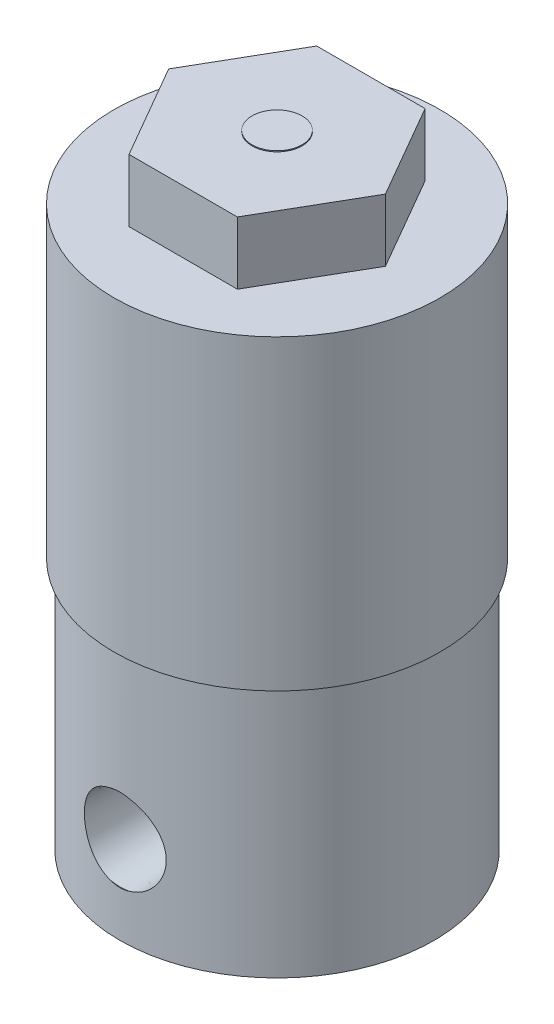
ISO-10303-21;
HEADER;
FILE_DESCRIPTION(('STEP AP214'),'2;1');
FILE_NAME('part.step','',(''),(''),'','','');
FILE_SCHEMA(('AUTOMOTIVE_DESIGN { 1 0 10303 214 1 1 1 1 }'));
ENDSEC;
DATA;
#1=APPLICATION_CONTEXT('core data for automotive mechanical design processes');
#2=APPLICATION_PROTOCOL_DEFINITION('international standard','automotive_design',2000,#1);
#3=PRODUCT_CONTEXT('',#1,'mechanical');
#4=PRODUCT('Part','Part','',(#3));
#5=PRODUCT_RELATED_PRODUCT_CATEGORY('part','',(#4));
#6=PRODUCT_DEFINITION_FORMATION('','',#4);
#7=PRODUCT_DEFINITION_CONTEXT('part definition',#1,'design');
#8=PRODUCT_DEFINITION('design','',#6,#7);
#9=PRODUCT_DEFINITION_SHAPE('','',#8);
#10=(LENGTH_UNIT() NAMED_UNIT(*) SI_UNIT(.MILLI.,.METRE.));
#11=(NAMED_UNIT(*) PLANE_ANGLE_UNIT() SI_UNIT($,.RADIAN.));
#12=(NAMED_UNIT(*) SI_UNIT($,.STERADIAN.) SOLID_ANGLE_UNIT());
#13=UNCERTAINTY_MEASURE_WITH_UNIT(LENGTH_MEASURE(1.E-05),#10,'distance_accuracy_value','');
#14=(GEOMETRIC_REPRESENTATION_CONTEXT(3) GLOBAL_UNCERTAINTY_ASSIGNED_CONTEXT((#13)) GLOBAL_UNIT_ASSIGNED_CONTEXT((#10,
#11,#12)) REPRESENTATION_CONTEXT('',''));
#15=CARTESIAN_POINT('',(0.,0.,0.));
#16=DIRECTION('',(0.,0.,1.));
#17=DIRECTION('',(1.,0.,0.));
#18=AXIS2_PLACEMENT_3D('',#15,#16,#17);
#19=CARTESIAN_POINT('',(0.,44.7,0.));
#20=DIRECTION('',(0.,1.,0.));
#21=DIRECTION('',(0.,0.,1.));
#22=AXIS2_PLACEMENT_3D('',#19,#20,#21);
#23=PLANE('',#22);
#24=CARTESIAN_POINT('',(0.,44.7,0.));
#25=DIRECTION('',(0.,1.,0.));
#26=DIRECTION('',(0.,0.,1.));
#27=AXIS2_PLACEMENT_3D('',#24,#25,#26);
#28=CIRCLE('',#27,13.03);
#29=CARTESIAN_POINT('',(0.,44.7,13.03));
#30=VERTEX_POINT('',#29);
#31=EDGE_CURVE('E221',#30,#30,#28,.T.);
#32=ORIENTED_EDGE('',*,*,#31,.T.);
#33=EDGE_LOOP('',(#32));
#34=FACE_BOUND('',#33,.T.);
#35=DIRECTION('',(-0.5,0.,-0.866025403784439));
#36=VECTOR('',#35,1.);
#37=CARTESIAN_POINT('',(8.66025403784438,44.7,0.));
#38=LINE('',#37,#36);
#39=CARTESIAN_POINT('',(8.66025403784438,44.7,0.));
#40=VERTEX_POINT('',#39);
#41=CARTESIAN_POINT('',(4.33012701892219,44.7,-7.5));
#42=VERTEX_POINT('',#41);
#43=EDGE_CURVE('E187',#40,#42,#38,.T.);
#44=ORIENTED_EDGE('',*,*,#43,.F.);
#45=DIRECTION('',(0.5,0.,-0.866025403784439));
#46=VECTOR('',#45,1.);
#47=CARTESIAN_POINT('',(4.33012701892219,44.7,7.5));
#48=LINE('',#47,#46);
#49=CARTESIAN_POINT('',(4.33012701892219,44.7,7.5));
#50=VERTEX_POINT('',#49);
#51=EDGE_CURVE('E162',#50,#40,#48,.T.);
#52=ORIENTED_EDGE('',*,*,#51,.F.);
#53=DIRECTION('',(1.,0.,0.));
#54=VECTOR('',#53,1.);
#55=CARTESIAN_POINT('',(-4.3301270189222,44.7,7.5));
#56=LINE('',#55,#54);
#57=CARTESIAN_POINT('',(-4.3301270189222,44.7,7.5));
#58=VERTEX_POINT('',#57);
#59=EDGE_CURVE('E168',#58,#50,#56,.T.);
#60=ORIENTED_EDGE('',*,*,#59,.F.);
#61=DIRECTION('',(0.5,0.,0.866025403784439));
#62=VECTOR('',#61,1.);
#63=CARTESIAN_POINT('',(-8.66025403784439,44.7,0.));
#64=LINE('',#63,#62);
#65=CARTESIAN_POINT('',(-8.66025403784439,44.7,0.));
#66=VERTEX_POINT('',#65);
#67=EDGE_CURVE('E196',#66,#58,#64,.T.);
#68=ORIENTED_EDGE('',*,*,#67,.F.);
#69=DIRECTION('',(-0.5,0.,0.866025403784439));
#70=VECTOR('',#69,1.);
#71=CARTESIAN_POINT('',(-4.3301270189222,44.7,-7.5));
#72=LINE('',#71,#70);
#73=CARTESIAN_POINT('',(-4.3301270189222,44.7,-7.5));
#74=VERTEX_POINT('',#73);
#75=EDGE_CURVE('E193',#74,#66,#72,.T.);
#76=ORIENTED_EDGE('',*,*,#75,.F.);
#77=DIRECTION('',(-1.,0.,0.));
#78=VECTOR('',#77,1.);
#79=CARTESIAN_POINT('',(4.33012701892219,44.7,-7.5));
#80=LINE('',#79,#78);
#81=EDGE_CURVE('E190',#42,#74,#80,.T.);
#82=ORIENTED_EDGE('',*,*,#81,.F.);
#83=EDGE_LOOP('',(#44,#52,#60,#68,#76,#82));
#84=FACE_BOUND('',#83,.T.);
#85=ADVANCED_FACE('F41',(#34,#84),#23,.T.);
#86=CARTESIAN_POINT('',(0.,20.19,0.));
#87=DIRECTION('',(0.,-1.,0.));
#88=DIRECTION('',(0.,0.,-1.));
#89=AXIS2_PLACEMENT_3D('',#86,#87,#88);
#90=CYLINDRICAL_SURFACE('',#89,12.56);
#91=CARTESIAN_POINT('',(0.788898573962425,3.76276021112784,-12.5352));
#92=CARTESIAN_POINT('',(0.877992046783151,3.78498595457341,-12.5296008390974));
#93=CARTESIAN_POINT('',(0.966077384943671,3.8109787394763,-12.5230958603472));
#94=CARTESIAN_POINT('',(1.13961109990667,3.87023240902184,-12.5084937022588));
#95=CARTESIAN_POINT('',(1.22506008108899,3.90349161350886,-12.5003968910304));
#96=CARTESIAN_POINT('',(1.39260427157268,3.97696220545809,-12.4828421567203));
#97=CARTESIAN_POINT('',(1.47470476337445,4.0171620739958,-12.4733864931202));
#98=CARTESIAN_POINT('',(1.63513200473562,4.1042165458238,-12.4533725275988));
#99=CARTESIAN_POINT('',(1.71345861244122,4.15107139900257,-12.4428141842769));
#100=CARTESIAN_POINT('',(1.94193866208237,4.30108963824454,-12.4099181050226));
#101=CARTESIAN_POINT('',(2.08580376350805,4.41379985096151,-12.3863360583298));
#102=CARTESIAN_POINT('',(2.35272921182999,4.66140672481568,-12.3384253170528));
#103=CARTESIAN_POINT('',(2.4757843498136,4.79630892417696,-12.3140964373251));
#104=CARTESIAN_POINT('',(2.70011309765983,5.08758685527581,-12.2668817928073));
#105=CARTESIAN_POINT('',(2.80093263275379,5.24431928583219,-12.2440318546701));
#106=CARTESIAN_POINT('',(2.97486996361045,5.57303338337697,-12.2029414624419));
#107=CARTESIAN_POINT('',(3.04798879807883,5.74501447828084,-12.184700835522));
#108=CARTESIAN_POINT('',(3.16368465755467,6.09775236998736,-12.1551741164053));
#109=CARTESIAN_POINT('',(3.2065413683194,6.27841186841878,-12.1438244778716));
#110=CARTESIAN_POINT('',(3.26134510157559,6.64465847523464,-12.1292232211872));
#111=CARTESIAN_POINT('',(3.27329977490954,6.83024435242987,-12.1259695986019));
#112=CARTESIAN_POINT('',(3.26599978076111,7.19557037188689,-12.127936523716));
#113=CARTESIAN_POINT('',(3.24760338180706,7.37532961380296,-12.1329240344468));
#114=CARTESIAN_POINT('',(3.18184035878198,7.72909360076873,-12.1503346674747));
#115=CARTESIAN_POINT('',(3.13447183564151,7.90309796780879,-12.1627582771932));
#116=CARTESIAN_POINT('',(3.01221767228601,8.24070982304539,-12.1936086121537));
#117=CARTESIAN_POINT('',(2.93731132732565,8.40430937937475,-12.2120398531426));
#118=CARTESIAN_POINT('',(2.76213964157896,8.71677696332193,-12.2528463849831));
#119=CARTESIAN_POINT('',(2.66187043273514,8.86564273908765,-12.2752222772706));
#120=CARTESIAN_POINT('',(2.43543081707597,9.14888464802036,-12.322174501744));
#121=CARTESIAN_POINT('',(2.30860961367872,9.28273365259162,-12.3467950977331));
#122=CARTESIAN_POINT('',(2.03425744986368,9.52735745722745,-12.3949490946325));
#123=CARTESIAN_POINT('',(1.88673087447343,9.63813713065744,-12.4184827243438));
#124=CARTESIAN_POINT('',(1.58596026109721,9.82649066148048,-12.4603225808739));
#125=CARTESIAN_POINT('',(1.43389528345359,9.9058827338659,-12.4788833610702));
#126=CARTESIAN_POINT('',(1.19760875195315,10.0064711699788,-12.5030254437535));
#127=CARTESIAN_POINT('',(1.11741366372719,10.0369344736574,-12.5104607952329));
#128=CARTESIAN_POINT('',(0.954748246454062,10.0914873284702,-12.523926455648));
#129=CARTESIAN_POINT('',(0.872277369583635,10.1155753299118,-12.529956422924));
#130=CARTESIAN_POINT('',(0.788898573962424,10.1363836809308,-12.5352));
#131=B_SPLINE_CURVE_WITH_KNOTS('',3,(#91,#92,#93,#94,#95,#96,#97,#98,#99,#100,#101,#102,#103,
#104,#105,#106,#107,#108,#109,#110,#111,#112,#113,#114,#115,#116,#117,#118,#119,#120,#121,#122,
#123,#124,#125,#126,#127,#128,#129,#130),.UNSPECIFIED.,.F.,.F.,(4,2,2,2,2,2,2,2,2,2,2,2,2,2,2,2,
2,2,2,4),(0.,0.275879747322894,0.551695772578802,0.827058370161299,1.10243131008807,
1.65248922542108,2.20268462183557,2.76324638468178,3.32378712580943,3.87907697197291,
4.43422932421709,4.97395047843362,5.51370701417062,6.05387020712794,6.59411582939499,
7.14959960399937,7.70496591409256,8.22029180163628,8.47837183534944,8.73651454502424),.UNSPECIFIED.);
#132=CARTESIAN_POINT('',(0.792070072657664,3.76355342756461,-12.535));
#133=VERTEX_POINT('',#132);
#134=CARTESIAN_POINT('',(0.79207007265764,10.135590464494,-12.535));
#135=VERTEX_POINT('',#134);
#136=EDGE_CURVE('E311',#133,#135,#131,.T.);
#137=ORIENTED_EDGE('',*,*,#136,.T.);
#138=CARTESIAN_POINT('',(0.83370061173436,10.1221594357594,-12.5322999999998));
#139=CARTESIAN_POINT('',(0.75486564278842,10.1483202494265,-12.5375535391951));
#140=CARTESIAN_POINT('',(0.674763011882068,10.1708365129458,-12.542126315415));
#141=CARTESIAN_POINT('',(0.512712357209269,10.208319226797,-12.5497907538505));
#142=CARTESIAN_POINT('',(0.430763677861175,10.2232829494152,-12.552881880926));
#143=CARTESIAN_POINT('',(0.268260713697007,10.2450468578194,-12.557390330899));
#144=CARTESIAN_POINT('',(0.187739079812136,10.2520799781308,-12.5588553923057));
#145=CARTESIAN_POINT('',(0.0264203248663634,10.2586834449056,-12.5602316878031));
#146=CARTESIAN_POINT('',(-0.0543766619753039,10.2582570178965,-12.5601435936903));
#147=CARTESIAN_POINT('',(-0.252425249853426,10.2480207968119,-12.5580085982188));
#148=CARTESIAN_POINT('',(-0.369470439382227,10.2340138359144,-12.5550853323868));
#149=CARTESIAN_POINT('',(-0.603200957254121,10.1901946543597,-12.5460766067035));
#150=CARTESIAN_POINT('',(-0.719817956967926,10.160031279743,-12.5399209528179));
#151=CARTESIAN_POINT('',(-0.833700611730567,10.1221594357607,-12.5323));
#152=B_SPLINE_CURVE_WITH_KNOTS('',3,(#138,#139,#140,#141,#142,#143,#144,#145,#146,#147,#148,
#149,#150,#151),.UNSPECIFIED.,.F.,.F.,(4,2,2,2,2,2,4),(0.,0.249612733617655,0.49931555423555,
0.741475862844617,0.983531430836682,1.3361532903437,1.69677018693214),.UNSPECIFIED.);
#153=CARTESIAN_POINT('',(-0.792070072657664,10.135590464494,-12.535));
#154=VERTEX_POINT('',#153);
#155=EDGE_CURVE('E11',#135,#154,#152,.T.);
#156=ORIENTED_EDGE('',*,*,#155,.T.);
#157=CARTESIAN_POINT('',(-0.78889857396244,10.1363836809308,-12.5352));
#158=CARTESIAN_POINT('',(-0.877992046783166,10.1141579374852,-12.5296008390974));
#159=CARTESIAN_POINT('',(-0.966077384943686,10.0881651525823,-12.5230958603472));
#160=CARTESIAN_POINT('',(-1.13961109990669,10.0289114830368,-12.5084937022588));
#161=CARTESIAN_POINT('',(-1.225060081089,9.99565227854978,-12.5003968910304));
#162=CARTESIAN_POINT('',(-1.39260427157269,9.92218168660055,-12.4828421567203));
#163=CARTESIAN_POINT('',(-1.47470476337446,9.88198181806284,-12.4733864931202));
#164=CARTESIAN_POINT('',(-1.63513200473563,9.79492734623484,-12.4533725275988));
#165=CARTESIAN_POINT('',(-1.71345861244123,9.74807249305606,-12.4428141842769));
#166=CARTESIAN_POINT('',(-1.94193866208238,9.59805425381409,-12.4099181050226));
#167=CARTESIAN_POINT('',(-2.08580376350806,9.48534404109713,-12.3863360583298));
#168=CARTESIAN_POINT('',(-2.35272921183,9.23773716724295,-12.3384253170528));
#169=CARTESIAN_POINT('',(-2.47578434981361,9.10283496788167,-12.3140964373251));
#170=CARTESIAN_POINT('',(-2.70011309765984,8.81155703678282,-12.2668817928073));
#171=CARTESIAN_POINT('',(-2.8009326327538,8.65482460622644,-12.2440318546701));
#172=CARTESIAN_POINT('',(-2.97486996361046,8.32611050868166,-12.2029414624419));
#173=CARTESIAN_POINT('',(-3.04798879807884,8.15412941377779,-12.184700835522));
#174=CARTESIAN_POINT('',(-3.16368465755467,7.80139152207126,-12.1551741164053));
#175=CARTESIAN_POINT('',(-3.2065413683194,7.62073202363984,-12.1438244778716));
#176=CARTESIAN_POINT('',(-3.26134510157559,7.25448541682398,-12.1292232211872));
#177=CARTESIAN_POINT('',(-3.27329977490954,7.06889953962876,-12.1259695986019));
#178=CARTESIAN_POINT('',(-3.26599978076111,6.70357352017174,-12.127936523716));
#179=CARTESIAN_POINT('',(-3.24760338180706,6.52381427825567,-12.1329240344468));
#180=CARTESIAN_POINT('',(-3.18184035878197,6.1700502912899,-12.1503346674747));
#181=CARTESIAN_POINT('',(-3.13447183564151,5.99604592424984,-12.1627582771932));
#182=CARTESIAN_POINT('',(-3.01221767228601,5.65843406901324,-12.1936086121537));
#183=CARTESIAN_POINT('',(-2.93731132732564,5.49483451268388,-12.2120398531426));
#184=CARTESIAN_POINT('',(-2.76213964157895,5.18236692873669,-12.2528463849831));
#185=CARTESIAN_POINT('',(-2.66187043273513,5.03350115297098,-12.2752222772706));
#186=CARTESIAN_POINT('',(-2.43543081707595,4.75025924403827,-12.322174501744));
#187=CARTESIAN_POINT('',(-2.30860961367871,4.61641023946701,-12.3467950977331));
#188=CARTESIAN_POINT('',(-2.03425744986367,4.37178643483119,-12.3949490946325));
#189=CARTESIAN_POINT('',(-1.88673087447342,4.2610067614012,-12.4184827243438));
#190=CARTESIAN_POINT('',(-1.5859602610972,4.07265323057816,-12.4603225808739));
#191=CARTESIAN_POINT('',(-1.43389528345359,3.99326115819274,-12.4788833610702));
#192=CARTESIAN_POINT('',(-1.19760875195315,3.89267272207982,-12.5030254437535));
#193=CARTESIAN_POINT('',(-1.1174136637272,3.86220941840128,-12.5104607952329));
#194=CARTESIAN_POINT('',(-0.954748246454074,3.8076565635884,-12.523926455648));
#195=CARTESIAN_POINT('',(-0.872277369583649,3.78356856214681,-12.529956422924));
#196=CARTESIAN_POINT('',(-0.78889857396244,3.76276021112784,-12.5352));
#197=B_SPLINE_CURVE_WITH_KNOTS('',3,(#157,#158,#159,#160,#161,#162,#163,#164,#165,#166,#167,
#168,#169,#170,#171,#172,#173,#174,#175,#176,#177,#178,#179,#180,#181,#182,#183,#184,#185,#186,
#187,#188,#189,#190,#191,#192,#193,#194,#195,#196),.UNSPECIFIED.,.F.,.F.,(4,2,2,2,2,2,2,2,2,2,2,
2,2,2,2,2,2,2,2,4),(0.,0.275879747322895,0.551695772578802,0.827058370161299,1.10243131008807,
1.65248922542108,2.20268462183557,2.76324638468179,3.32378712580943,3.87907697197291,
4.43422932421709,4.97395047843362,5.51370701417062,6.05387020712794,6.59411582939499,
7.14959960399937,7.70496591409256,8.22029180163626,8.47837183534942,8.73651454502421),.UNSPECIFIED.);
#198=CARTESIAN_POINT('',(-0.792070072657664,3.76355342756461,-12.535));
#199=VERTEX_POINT('',#198);
#200=EDGE_CURVE('E52',#154,#199,#197,.T.);
#201=ORIENTED_EDGE('',*,*,#200,.T.);
#202=CARTESIAN_POINT('',(-0.833700611730567,3.77698445629794,-12.5323));
#203=CARTESIAN_POINT('',(-0.754865642784579,3.75082364263098,-12.5375535391953));
#204=CARTESIAN_POINT('',(-0.674763011878184,3.72830737911185,-12.5421263154152));
#205=CARTESIAN_POINT('',(-0.512712357205311,3.69082466526084,-12.5497907538507));
#206=CARTESIAN_POINT('',(-0.430763677857186,3.67586094264275,-12.5528818809261));
#207=CARTESIAN_POINT('',(-0.268260713692968,3.6540970342388,-12.557390330899));
#208=CARTESIAN_POINT('',(-0.187739079808078,3.64706391392752,-12.5588553923058));
#209=CARTESIAN_POINT('',(-0.0264203248622799,3.64046044715303,-12.5602316878031));
#210=CARTESIAN_POINT('',(0.0543766619793943,3.64088687416224,-12.5601435936902));
#211=CARTESIAN_POINT('',(0.252425249857493,3.65112309524717,-12.5580085982188));
#212=CARTESIAN_POINT('',(0.369470439386257,3.66513005614486,-12.5550853323866));
#213=CARTESIAN_POINT('',(0.603200957258053,3.70894923769991,-12.5460766067034));
#214=CARTESIAN_POINT('',(0.719817956971795,3.73911261231672,-12.5399209528177));
#215=CARTESIAN_POINT('',(0.833700611734362,3.77698445629919,-12.5322999999998));
#216=B_SPLINE_CURVE_WITH_KNOTS('',3,(#202,#203,#204,#205,#206,#207,#208,#209,#210,#211,#212,
#213,#214,#215),.UNSPECIFIED.,.F.,.F.,(4,2,2,2,2,2,4),(0.,0.249612733617679,0.499315554235597,
0.741475862844686,0.983531430836774,1.33615329034375,1.69677018693215),.UNSPECIFIED.);
#217=EDGE_CURVE('E325',#199,#133,#216,.T.);
#218=ORIENTED_EDGE('',*,*,#217,.T.);
#219=EDGE_LOOP('',(#137,#156,#201,#218));
#220=FACE_BOUND('',#219,.T.);
#221=CARTESIAN_POINT('',(-0.788898573962439,3.77318826509852,12.5352));
#222=CARTESIAN_POINT('',(-0.877992046783166,3.7954140085441,12.5296008390974));
#223=CARTESIAN_POINT('',(-0.966077384943686,3.82140679344699,12.5230958603472));
#224=CARTESIAN_POINT('',(-1.13961109990669,3.88066046299252,12.5084937022588));
#225=CARTESIAN_POINT('',(-1.225060081089,3.91391966747954,12.5003968910304));
#226=CARTESIAN_POINT('',(-1.39260427157269,3.98739025942877,12.4828421567203));
#227=CARTESIAN_POINT('',(-1.47470476337446,4.02759012796648,12.4733864931202));
#228=CARTESIAN_POINT('',(-1.63513200473563,4.11464459979448,12.4533725275988));
#229=CARTESIAN_POINT('',(-1.71345861244123,4.16149945297326,12.4428141842769));
#230=CARTESIAN_POINT('',(-1.94193866208238,4.31151769221523,12.4099181050226));
#231=CARTESIAN_POINT('',(-2.08580376350806,4.4242279049322,12.3863360583298));
#232=CARTESIAN_POINT('',(-2.35272921183,4.67183477878637,12.3384253170528));
#233=CARTESIAN_POINT('',(-2.47578434981361,4.80673697814765,12.3140964373251));
#234=CARTESIAN_POINT('',(-2.70011309765984,5.0980149092465,12.2668817928073));
#235=CARTESIAN_POINT('',(-2.8009326327538,5.25474733980288,12.2440318546701));
#236=CARTESIAN_POINT('',(-2.97486996361045,5.58346143734766,12.2029414624419));
#237=CARTESIAN_POINT('',(-3.04798879807883,5.75544253225153,12.184700835522));
#238=CARTESIAN_POINT('',(-3.16368465755467,6.10818042395806,12.1551741164053));
#239=CARTESIAN_POINT('',(-3.2065413683194,6.28883992238948,12.1438244778716));
#240=CARTESIAN_POINT('',(-3.26134510157559,6.65508652920534,12.1292232211872));
#241=CARTESIAN_POINT('',(-3.27329977490954,6.84067240640057,12.1259695986019));
#242=CARTESIAN_POINT('',(-3.26599978076111,7.20599842585758,12.127936523716));
#243=CARTESIAN_POINT('',(-3.24760338180706,7.38575766777366,12.1329240344468));
#244=CARTESIAN_POINT('',(-3.18184035878197,7.73952165473942,12.1503346674747));
#245=CARTESIAN_POINT('',(-3.13447183564151,7.91352602177949,12.1627582771932));
#246=CARTESIAN_POINT('',(-3.01221767228601,8.25113787701608,12.1936086121537));
#247=CARTESIAN_POINT('',(-2.93731132732564,8.41473743334544,12.2120398531426));
#248=CARTESIAN_POINT('',(-2.76213964157895,8.72720501729263,12.2528463849831));
#249=CARTESIAN_POINT('',(-2.66187043273513,8.87607079305835,12.2752222772706));
#250=CARTESIAN_POINT('',(-2.43543081707595,9.15931270199105,12.322174501744));
#251=CARTESIAN_POINT('',(-2.30860961367871,9.29316170656231,12.3467950977331));
#252=CARTESIAN_POINT('',(-2.03425744986366,9.53778551119813,12.3949490946325));
#253=CARTESIAN_POINT('',(-1.88673087447342,9.64856518462813,12.4184827243438));
#254=CARTESIAN_POINT('',(-1.5859602610972,9.83691871545116,12.4603225808739));
#255=CARTESIAN_POINT('',(-1.43389528345359,9.91631078783658,12.4788833610702));
#256=CARTESIAN_POINT('',(-1.19760875195315,10.0168992239495,12.5030254437535));
#257=CARTESIAN_POINT('',(-1.11741366372719,10.047362527628,12.5104607952329));
#258=CARTESIAN_POINT('',(-0.954748246454072,10.1019153824409,12.523926455648));
#259=CARTESIAN_POINT('',(-0.872277369583648,10.1260033838825,12.529956422924));
#260=CARTESIAN_POINT('',(-0.788898573962439,10.1468117349015,12.5352));
#261=B_SPLINE_CURVE_WITH_KNOTS('',3,(#221,#222,#223,#224,#225,#226,#227,#228,#229,#230,#231,
#232,#233,#234,#235,#236,#237,#238,#239,#240,#241,#242,#243,#244,#245,#246,#247,#248,#249,#250,
#251,#252,#253,#254,#255,#256,#257,#258,#259,#260),.UNSPECIFIED.,.F.,.F.,(4,2,2,2,2,2,2,2,2,2,2,
2,2,2,2,2,2,2,2,4),(0.,0.275879747322894,0.551695772578802,0.8270583701613,1.10243131008807,
1.65248922542108,2.20268462183557,2.76324638468179,3.32378712580943,3.87907697197291,
4.43422932421709,4.97395047843362,5.51370701417062,6.05387020712794,6.59411582939499,
7.14959960399937,7.70496591409256,8.22029180163626,8.47837183534942,8.7365145450242),.UNSPECIFIED.);
#262=CARTESIAN_POINT('',(-0.792070072657664,3.77398148153529,12.535));
#263=VERTEX_POINT('',#262);
#264=CARTESIAN_POINT('',(-0.792070072657664,10.1460185184647,12.535));
#265=VERTEX_POINT('',#264);
#266=EDGE_CURVE('E283',#263,#265,#261,.T.);
#267=ORIENTED_EDGE('',*,*,#266,.T.);
#268=CARTESIAN_POINT('',(-0.833700611730567,10.1325874897314,12.5323));
#269=CARTESIAN_POINT('',(-0.75486564278458,10.1587483033983,12.5375535391953));
#270=CARTESIAN_POINT('',(-0.674763011878186,10.1812645669175,12.5421263154152));
#271=CARTESIAN_POINT('',(-0.512712357205314,10.2187472807685,12.5497907538507));
#272=CARTESIAN_POINT('',(-0.430763677857189,10.2337110033866,12.5528818809261));
#273=CARTESIAN_POINT('',(-0.268260713692973,10.2554749117905,12.557390330899));
#274=CARTESIAN_POINT('',(-0.187739079808084,10.2625080321018,12.5588553923058));
#275=CARTESIAN_POINT('',(-0.0264203248622866,10.2691114988763,12.5602316878031));
#276=CARTESIAN_POINT('',(0.054376661979387,10.2686850718671,12.5601435936902));
#277=CARTESIAN_POINT('',(0.252425249857486,10.2584488507822,12.5580085982188));
#278=CARTESIAN_POINT('',(0.369470439386251,10.2444418898845,12.5550853323866));
#279=CARTESIAN_POINT('',(0.603200957258049,10.2006227083294,12.5460766067034));
#280=CARTESIAN_POINT('',(0.719817956971792,10.1704593337126,12.5399209528177));
#281=CARTESIAN_POINT('',(0.83370061173436,10.1325874897301,12.5322999999998));
#282=B_SPLINE_CURVE_WITH_KNOTS('',3,(#268,#269,#270,#271,#272,#273,#274,#275,#276,#277,#278,
#279,#280,#281),.UNSPECIFIED.,.F.,.F.,(4,2,2,2,2,2,4),(0.,0.249612733617677,0.499315554235593,
0.74147586284468,0.983531430836766,1.33615329034374,1.69677018693214),.UNSPECIFIED.);
#283=CARTESIAN_POINT('',(0.792070072657664,10.1460185184647,12.535));
#284=VERTEX_POINT('',#283);
#285=EDGE_CURVE('E303',#265,#284,#282,.T.);
#286=ORIENTED_EDGE('',*,*,#285,.T.);
#287=CARTESIAN_POINT('',(0.788898573962424,10.1468117349015,12.5352));
#288=CARTESIAN_POINT('',(0.877992046783151,10.1245859914559,12.5296008390974));
#289=CARTESIAN_POINT('',(0.96607738494367,10.098593206553,12.5230958603472));
#290=CARTESIAN_POINT('',(1.13961109990667,10.0393395370075,12.5084937022588));
#291=CARTESIAN_POINT('',(1.22506008108899,10.0060803325205,12.5003968910304));
#292=CARTESIAN_POINT('',(1.39260427157268,9.93260974057123,12.4828421567203));
#293=CARTESIAN_POINT('',(1.47470476337444,9.89240987203353,12.4733864931202));
#294=CARTESIAN_POINT('',(1.63513200473562,9.80535540020552,12.4533725275988));
#295=CARTESIAN_POINT('',(1.71345861244122,9.75850054702675,12.4428141842769));
#296=CARTESIAN_POINT('',(1.94193866208237,9.60848230778478,12.4099181050226));
#297=CARTESIAN_POINT('',(2.08580376350804,9.49577209506782,12.3863360583298));
#298=CARTESIAN_POINT('',(2.35272921182999,9.24816522121364,12.3384253170528));
#299=CARTESIAN_POINT('',(2.4757843498136,9.11326302185236,12.3140964373251));
#300=CARTESIAN_POINT('',(2.70011309765983,8.82198509075351,12.2668817928073));
#301=CARTESIAN_POINT('',(2.80093263275379,8.66525266019713,12.2440318546701));
#302=CARTESIAN_POINT('',(2.97486996361045,8.33653856265235,12.2029414624419));
#303=CARTESIAN_POINT('',(3.04798879807883,8.16455746774849,12.184700835522));
#304=CARTESIAN_POINT('',(3.16368465755467,7.81181957604196,12.1551741164053));
#305=CARTESIAN_POINT('',(3.2065413683194,7.63116007761054,12.1438244778716));
#306=CARTESIAN_POINT('',(3.26134510157559,7.26491347079468,12.1292232211872));
#307=CARTESIAN_POINT('',(3.27329977490954,7.07932759359945,12.1259695986019));
#308=CARTESIAN_POINT('',(3.26599978076111,6.71400157414244,12.127936523716));
#309=CARTESIAN_POINT('',(3.24760338180706,6.53424233222636,12.1329240344468));
#310=CARTESIAN_POINT('',(3.18184035878198,6.1804783452606,12.1503346674747));
#311=CARTESIAN_POINT('',(3.13447183564151,6.00647397822053,12.1627582771932));
#312=CARTESIAN_POINT('',(3.01221767228601,5.66886212298394,12.1936086121537));
#313=CARTESIAN_POINT('',(2.93731132732565,5.50526256665458,12.2120398531426));
#314=CARTESIAN_POINT('',(2.76213964157896,5.19279498270739,12.2528463849831));
#315=CARTESIAN_POINT('',(2.66187043273514,5.04392920694167,12.2752222772706));
#316=CARTESIAN_POINT('',(2.43543081707597,4.76068729800896,12.322174501744));
#317=CARTESIAN_POINT('',(2.30860961367872,4.6268382934377,12.3467950977331));
#318=CARTESIAN_POINT('',(2.03425744986368,4.38221448880188,12.3949490946325));
#319=CARTESIAN_POINT('',(1.88673087447343,4.27143481537189,12.4184827243438));
#320=CARTESIAN_POINT('',(1.58596026109721,4.08308128454884,12.4603225808739));
#321=CARTESIAN_POINT('',(1.43389528345359,4.00368921216342,12.4788833610702));
#322=CARTESIAN_POINT('',(1.19760875195315,3.9031007760505,12.5030254437535));
#323=CARTESIAN_POINT('',(1.11741366372719,3.87263747237196,12.5104607952329));
#324=CARTESIAN_POINT('',(0.954748246454063,3.81808461755908,12.523926455648));
#325=CARTESIAN_POINT('',(0.872277369583636,3.79399661611748,12.529956422924));
#326=CARTESIAN_POINT('',(0.788898573962424,3.77318826509851,12.5352));
#327=B_SPLINE_CURVE_WITH_KNOTS('',3,(#287,#288,#289,#290,#291,#292,#293,#294,#295,#296,#297,
#298,#299,#300,#301,#302,#303,#304,#305,#306,#307,#308,#309,#310,#311,#312,#313,#314,#315,#316,
#317,#318,#319,#320,#321,#322,#323,#324,#325,#326),.UNSPECIFIED.,.F.,.F.,(4,2,2,2,2,2,2,2,2,2,2,
2,2,2,2,2,2,2,2,4),(0.,0.275879747322893,0.5516957725788,0.827058370161298,1.10243131008807,
1.65248922542108,2.20268462183556,2.76324638468178,3.32378712580943,3.87907697197291,
4.43422932421709,4.97395047843362,5.51370701417062,6.05387020712794,6.59411582939498,
7.14959960399936,7.70496591409256,8.22029180163627,8.47837183534944,8.73651454502424),.UNSPECIFIED.);
#328=CARTESIAN_POINT('',(0.792070072657664,3.77398148153529,12.535));
#329=VERTEX_POINT('',#328);
#330=EDGE_CURVE('E312',#284,#329,#327,.T.);
#331=ORIENTED_EDGE('',*,*,#330,.T.);
#332=CARTESIAN_POINT('',(0.833700611734362,3.78741251026987,12.5322999999998));
#333=CARTESIAN_POINT('',(0.754865642788423,3.7612516966028,12.5375535391951));
#334=CARTESIAN_POINT('',(0.674763011882071,3.73873543308355,12.542126315415));
#335=CARTESIAN_POINT('',(0.512712357209274,3.70125271923231,12.5497907538505));
#336=CARTESIAN_POINT('',(0.43076367786118,3.68628899661409,12.552881880926));
#337=CARTESIAN_POINT('',(0.268260713697014,3.6645250882099,12.557390330899));
#338=CARTESIAN_POINT('',(0.187739079812143,3.65749196789849,12.5588553923057));
#339=CARTESIAN_POINT('',(0.0264203248663719,3.65088850112375,12.5602316878031));
#340=CARTESIAN_POINT('',(-0.0543766619752948,3.65131492813283,12.5601435936903));
#341=CARTESIAN_POINT('',(-0.252425249853418,3.66155114921746,12.5580085982188));
#342=CARTESIAN_POINT('',(-0.369470439382221,3.67555811011497,12.5550853323868));
#343=CARTESIAN_POINT('',(-0.603200957254119,3.71937729166966,12.5460766067035));
#344=CARTESIAN_POINT('',(-0.719817956967925,3.74954066628631,12.5399209528179));
#345=CARTESIAN_POINT('',(-0.833700611730567,3.78741251026862,12.5323));
#346=B_SPLINE_CURVE_WITH_KNOTS('',3,(#332,#333,#334,#335,#336,#337,#338,#339,#340,#341,#342,
#343,#344,#345),.UNSPECIFIED.,.F.,.F.,(4,2,2,2,2,2,4),(0.,0.249612733617653,0.499315554235546,
0.741475862844611,0.983531430836675,1.3361532903437,1.69677018693215),.UNSPECIFIED.);
#347=EDGE_CURVE('E271',#329,#263,#346,.T.);
#348=ORIENTED_EDGE('',*,*,#347,.T.);
#349=EDGE_LOOP('',(#267,#286,#331,#348));
#350=FACE_BOUND('',#349,.T.);
#351=CARTESIAN_POINT('',(0.,20.19,0.));
#352=DIRECTION('',(0.,1.,0.));
#353=DIRECTION('',(0.,0.,1.));
#354=AXIS2_PLACEMENT_3D('',#351,#352,#353);
#355=CIRCLE('',#354,12.56);
#356=CARTESIAN_POINT('',(0.,20.19,12.56));
#357=VERTEX_POINT('',#356);
#358=EDGE_CURVE('E267',#357,#357,#355,.T.);
#359=ORIENTED_EDGE('',*,*,#358,.F.);
#360=EDGE_LOOP('',(#359));
#361=FACE_BOUND('',#360,.T.);
#362=CARTESIAN_POINT('',(0.,0.,0.));
#363=DIRECTION('',(0.,1.,0.));
#364=DIRECTION('',(0.,0.,1.));
#365=AXIS2_PLACEMENT_3D('',#362,#363,#364);
#366=CIRCLE('',#365,12.56);
#367=CARTESIAN_POINT('',(0.,0.,12.56));
#368=VERTEX_POINT('',#367);
#369=EDGE_CURVE('E266',#368,#368,#366,.T.);
#370=ORIENTED_EDGE('',*,*,#369,.T.);
#371=EDGE_LOOP('',(#370));
#372=FACE_BOUND('',#371,.T.);
#373=ADVANCED_FACE('F43',(#220,#350,#361,#372),#90,.T.);
#374=CARTESIAN_POINT('',(0.,0.,0.));
#375=DIRECTION('',(0.,1.,0.));
#376=DIRECTION('',(0.,0.,1.));
#377=AXIS2_PLACEMENT_3D('',#374,#375,#376);
#378=PLANE('',#377);
#379=CARTESIAN_POINT('',(-9.33500000000009,0.,0.));
#380=DIRECTION('',(0.,-1.,0.));
#381=DIRECTION('',(0.,0.,-1.));
#382=AXIS2_PLACEMENT_3D('',#379,#380,#381);
#383=CIRCLE('',#382,2.8829);
#384=CARTESIAN_POINT('',(-9.33500000000009,0.,-2.8829));
#385=VERTEX_POINT('',#384);
#386=EDGE_CURVE('E151',#385,#385,#383,.T.);
#387=ORIENTED_EDGE('',*,*,#386,.F.);
#388=EDGE_LOOP('',(#387));
#389=FACE_BOUND('',#388,.T.);
#390=CARTESIAN_POINT('',(9.335,0.,0.));
#391=DIRECTION('',(0.,-1.,0.));
#392=DIRECTION('',(0.,0.,-1.));
#393=AXIS2_PLACEMENT_3D('',#390,#391,#392);
#394=CIRCLE('',#393,2.8829);
#395=CARTESIAN_POINT('',(9.335,0.,-2.8829));
#396=VERTEX_POINT('',#395);
#397=EDGE_CURVE('E142',#396,#396,#394,.T.);
#398=ORIENTED_EDGE('',*,*,#397,.F.);
#399=EDGE_LOOP('',(#398));
#400=FACE_BOUND('',#399,.T.);
#401=ORIENTED_EDGE('',*,*,#369,.F.);
#402=EDGE_LOOP('',(#401));
#403=FACE_BOUND('',#402,.T.);
#404=ADVANCED_FACE('F407',(#389,#400,#403),#378,.F.);
#405=CARTESIAN_POINT('',(0.,6.96,12.535));
#406=DIRECTION('',(0.,0.,1.));
#407=DIRECTION('',(1.,0.,0.));
#408=AXIS2_PLACEMENT_3D('',#405,#406,#407);
#409=CONICAL_SURFACE('',#408,3.283,0.0312064870256584);
#410=CARTESIAN_POINT('',(0.,6.96,5.16));
#411=DIRECTION('',(0.,0.,1.));
#412=DIRECTION('',(1.,0.,0.));
#413=AXIS2_PLACEMENT_3D('',#410,#411,#412);
#414=CIRCLE('',#413,3.05277741964332);
#415=CARTESIAN_POINT('',(3.05277741964332,6.96,5.16));
#416=VERTEX_POINT('',#415);
#417=EDGE_CURVE('E254',#416,#416,#414,.T.);
#418=ORIENTED_EDGE('',*,*,#417,.F.);
#419=EDGE_LOOP('',(#418));
#420=FACE_BOUND('',#419,.T.);
#421=CARTESIAN_POINT('',(0.,6.96,12.535));
#422=DIRECTION('',(0.,0.,1.));
#423=DIRECTION('',(1.,0.,0.));
#424=AXIS2_PLACEMENT_3D('',#421,#422,#423);
#425=CIRCLE('',#424,3.283);
#426=EDGE_CURVE('E250',#284,#265,#425,.T.);
#427=ORIENTED_EDGE('',*,*,#426,.T.);
#428=ORIENTED_EDGE('',*,*,#266,.F.);
#429=EDGE_CURVE('E249',#263,#329,#425,.T.);
#430=ORIENTED_EDGE('',*,*,#429,.T.);
#431=ORIENTED_EDGE('',*,*,#330,.F.);
#432=EDGE_LOOP('',(#427,#428,#430,#431));
#433=FACE_BOUND('',#432,.T.);
#434=ADVANCED_FACE('F295',(#420,#433),#409,.F.);
#435=CARTESIAN_POINT('',(0.,6.96,12.56));
#436=DIRECTION('',(0.,0.,1.));
#437=DIRECTION('',(1.,0.,0.));
#438=AXIS2_PLACEMENT_3D('',#435,#436,#437);
#439=CONICAL_SURFACE('',#438,3.308,0.785398163397431);
#440=ORIENTED_EDGE('',*,*,#426,.F.);
#441=ORIENTED_EDGE('',*,*,#285,.F.);
#442=EDGE_LOOP('',(#440,#441));
#443=FACE_BOUND('',#442,.T.);
#444=ADVANCED_FACE('F290',(#443),#439,.F.);
#445=ORIENTED_EDGE('',*,*,#429,.F.);
#446=ORIENTED_EDGE('',*,*,#347,.F.);
#447=EDGE_LOOP('',(#445,#446));
#448=FACE_BOUND('',#447,.T.);
#449=ADVANCED_FACE('F294',(#448),#439,.F.);
#450=CARTESIAN_POINT('',(0.,6.96,4.06));
#451=DIRECTION('',(0.,0.,1.));
#452=DIRECTION('',(1.,0.,0.));
#453=AXIS2_PLACEMENT_3D('',#450,#451,#452);
#454=CONICAL_SURFACE('',#453,3.95,1.02974425867665);
#455=CARTESIAN_POINT('',(0.,6.96,1.68660055484114));
#456=VERTEX_POINT('',#455);
#457=VERTEX_LOOP('',#456);
#458=FACE_BOUND('',#457,.T.);
#459=CARTESIAN_POINT('',(0.,6.96,4.06));
#460=DIRECTION('',(0.,0.,1.));
#461=DIRECTION('',(1.,0.,0.));
#462=AXIS2_PLACEMENT_3D('',#459,#460,#461);
#463=CIRCLE('',#462,3.95);
#464=CARTESIAN_POINT('',(3.95,6.96,4.06));
#465=VERTEX_POINT('',#464);
#466=EDGE_CURVE('E262',#465,#465,#463,.T.);
#467=ORIENTED_EDGE('',*,*,#466,.T.);
#468=EDGE_LOOP('',(#467));
#469=FACE_BOUND('',#468,.T.);
#470=ADVANCED_FACE('F507',(#458,#469),#454,.F.);
#471=CARTESIAN_POINT('',(0.,6.96,12.56));
#472=DIRECTION('',(0.,0.,1.));
#473=DIRECTION('',(1.,0.,0.));
#474=AXIS2_PLACEMENT_3D('',#471,#472,#473);
#475=CYLINDRICAL_SURFACE('',#474,3.95);
#476=ORIENTED_EDGE('',*,*,#466,.F.);
#477=EDGE_LOOP('',(#476));
#478=FACE_BOUND('',#477,.T.);
#479=CARTESIAN_POINT('',(0.,6.96,5.16));
#480=DIRECTION('',(0.,0.,1.));
#481=DIRECTION('',(1.,0.,0.));
#482=AXIS2_PLACEMENT_3D('',#479,#480,#481);
#483=CIRCLE('',#482,3.95);
#484=CARTESIAN_POINT('',(3.95,6.96,5.16));
#485=VERTEX_POINT('',#484);
#486=EDGE_CURVE('E258',#485,#485,#483,.T.);
#487=ORIENTED_EDGE('',*,*,#486,.T.);
#488=EDGE_LOOP('',(#487));
#489=FACE_BOUND('',#488,.T.);
#490=ADVANCED_FACE('F500',(#478,#489),#475,.F.);
#491=CARTESIAN_POINT('',(3.95,6.96,5.16));
#492=DIRECTION('',(0.,0.,1.));
#493=DIRECTION('',(1.,0.,0.));
#494=AXIS2_PLACEMENT_3D('',#491,#492,#493);
#495=PLANE('',#494);
#496=ORIENTED_EDGE('',*,*,#486,.F.);
#497=EDGE_LOOP('',(#496));
#498=FACE_BOUND('',#497,.T.);
#499=ORIENTED_EDGE('',*,*,#417,.T.);
#500=EDGE_LOOP('',(#499));
#501=FACE_BOUND('',#500,.T.);
#502=ADVANCED_FACE('F493',(#498,#501),#495,.F.);
#503=CARTESIAN_POINT('',(0.,6.94957194602932,-12.56));
#504=DIRECTION('',(0.,0.,-1.));
#505=DIRECTION('',(-1.,0.,0.));
#506=AXIS2_PLACEMENT_3D('',#503,#504,#505);
#507=CONICAL_SURFACE('',#506,3.308,0.785398163397414);
#508=CARTESIAN_POINT('',(0.,6.94957194602932,-12.535));
#509=DIRECTION('',(0.,0.,-1.));
#510=DIRECTION('',(-1.,0.,0.));
#511=AXIS2_PLACEMENT_3D('',#508,#509,#510);
#512=CIRCLE('',#511,3.283);
#513=EDGE_CURVE('E234',#154,#135,#512,.T.);
#514=ORIENTED_EDGE('',*,*,#513,.F.);
#515=ORIENTED_EDGE('',*,*,#155,.F.);
#516=EDGE_LOOP('',(#514,#515));
#517=FACE_BOUND('',#516,.T.);
#518=ADVANCED_FACE('F338',(#517),#507,.F.);
#519=EDGE_CURVE('E233',#133,#199,#512,.T.);
#520=ORIENTED_EDGE('',*,*,#519,.F.);
#521=ORIENTED_EDGE('',*,*,#217,.F.);
#522=EDGE_LOOP('',(#520,#521));
#523=FACE_BOUND('',#522,.T.);
#524=ADVANCED_FACE('F336',(#523),#507,.F.);
#525=CARTESIAN_POINT('',(0.,6.94957194602932,-12.535));
#526=DIRECTION('',(0.,0.,-1.));
#527=DIRECTION('',(-1.,0.,0.));
#528=AXIS2_PLACEMENT_3D('',#525,#526,#527);
#529=CONICAL_SURFACE('',#528,3.283,0.0312064870256583);
#530=CARTESIAN_POINT('',(0.,6.94957194602932,-5.16));
#531=DIRECTION('',(0.,0.,-1.));
#532=DIRECTION('',(-1.,0.,0.));
#533=AXIS2_PLACEMENT_3D('',#530,#531,#532);
#534=CIRCLE('',#533,3.05277741964332);
#535=CARTESIAN_POINT('',(-3.05277741964332,6.94957194602932,-5.16));
#536=VERTEX_POINT('',#535);
#537=EDGE_CURVE('E237',#536,#536,#534,.T.);
#538=ORIENTED_EDGE('',*,*,#537,.F.);
#539=EDGE_LOOP('',(#538));
#540=FACE_BOUND('',#539,.T.);
#541=ORIENTED_EDGE('',*,*,#513,.T.);
#542=ORIENTED_EDGE('',*,*,#136,.F.);
#543=ORIENTED_EDGE('',*,*,#519,.T.);
#544=ORIENTED_EDGE('',*,*,#200,.F.);
#545=EDGE_LOOP('',(#541,#542,#543,#544));
#546=FACE_BOUND('',#545,.T.);
#547=ADVANCED_FACE('F332',(#540,#546),#529,.F.);
#548=CARTESIAN_POINT('',(0.,6.94957194602932,-4.06000000000001));
#549=DIRECTION('',(0.,0.,-1.));
#550=DIRECTION('',(-1.,0.,0.));
#551=AXIS2_PLACEMENT_3D('',#548,#549,#550);
#552=CONICAL_SURFACE('',#551,3.95000000000001,1.02974425867666);
#553=CARTESIAN_POINT('',(0.,6.94957194602932,-1.68660055484114));
#554=VERTEX_POINT('',#553);
#555=VERTEX_LOOP('',#554);
#556=FACE_BOUND('',#555,.T.);
#557=CARTESIAN_POINT('',(0.,6.94957194602932,-4.06000000000001));
#558=DIRECTION('',(0.,0.,-1.));
#559=DIRECTION('',(-1.,0.,0.));
#560=AXIS2_PLACEMENT_3D('',#557,#558,#559);
#561=CIRCLE('',#560,3.95000000000001);
#562=CARTESIAN_POINT('',(-3.95000000000001,6.94957194602932,-4.06000000000001));
#563=VERTEX_POINT('',#562);
#564=EDGE_CURVE('E245',#563,#563,#561,.T.);
#565=ORIENTED_EDGE('',*,*,#564,.T.);
#566=EDGE_LOOP('',(#565));
#567=FACE_BOUND('',#566,.T.);
#568=ADVANCED_FACE('F297',(#556,#567),#552,.F.);
#569=CARTESIAN_POINT('',(0.,6.94957194602932,-12.56));
#570=DIRECTION('',(0.,0.,-1.));
#571=DIRECTION('',(-1.,0.,0.));
#572=AXIS2_PLACEMENT_3D('',#569,#570,#571);
#573=CYLINDRICAL_SURFACE('',#572,3.95000000000001);
#574=ORIENTED_EDGE('',*,*,#564,.F.);
#575=EDGE_LOOP('',(#574));
#576=FACE_BOUND('',#575,.T.);
#577=CARTESIAN_POINT('',(0.,6.94957194602932,-5.16));
#578=DIRECTION('',(0.,0.,-1.));
#579=DIRECTION('',(-1.,0.,0.));
#580=AXIS2_PLACEMENT_3D('',#577,#578,#579);
#581=CIRCLE('',#580,3.95000000000001);
#582=CARTESIAN_POINT('',(-3.95000000000001,6.94957194602932,-5.16));
#583=VERTEX_POINT('',#582);
#584=EDGE_CURVE('E241',#583,#583,#581,.T.);
#585=ORIENTED_EDGE('',*,*,#584,.T.);
#586=EDGE_LOOP('',(#585));
#587=FACE_BOUND('',#586,.T.);
#588=ADVANCED_FACE('F465',(#576,#587),#573,.F.);
#589=CARTESIAN_POINT('',(3.95000000000001,6.94957194602932,-5.16));
#590=DIRECTION('',(0.,0.,-1.));
#591=DIRECTION('',(-1.,0.,0.));
#592=AXIS2_PLACEMENT_3D('',#589,#590,#591);
#593=PLANE('',#592);
#594=ORIENTED_EDGE('',*,*,#584,.F.);
#595=EDGE_LOOP('',(#594));
#596=FACE_BOUND('',#595,.T.);
#597=ORIENTED_EDGE('',*,*,#537,.T.);
#598=EDGE_LOOP('',(#597));
#599=FACE_BOUND('',#598,.T.);
#600=ADVANCED_FACE('F341',(#596,#599),#593,.F.);
#601=CARTESIAN_POINT('',(0.,44.7,0.));
#602=DIRECTION('',(0.,-1.,0.));
#603=DIRECTION('',(0.,0.,-1.));
#604=AXIS2_PLACEMENT_3D('',#601,#602,#603);
#605=CYLINDRICAL_SURFACE('',#604,13.03);
#606=ORIENTED_EDGE('',*,*,#31,.F.);
#607=EDGE_LOOP('',(#606));
#608=FACE_BOUND('',#607,.T.);
#609=CARTESIAN_POINT('',(0.,20.19,0.));
#610=DIRECTION('',(0.,1.,0.));
#611=DIRECTION('',(0.,0.,1.));
#612=AXIS2_PLACEMENT_3D('',#609,#610,#611);
#613=CIRCLE('',#612,13.03);
#614=CARTESIAN_POINT('',(0.,20.19,13.03));
#615=VERTEX_POINT('',#614);
#616=EDGE_CURVE('E226',#615,#615,#613,.T.);
#617=ORIENTED_EDGE('',*,*,#616,.T.);
#618=EDGE_LOOP('',(#617));
#619=FACE_BOUND('',#618,.T.);
#620=ADVANCED_FACE('F414',(#608,#619),#605,.T.);
#621=CARTESIAN_POINT('',(0.,20.19,0.));
#622=DIRECTION('',(0.,1.,0.));
#623=DIRECTION('',(0.,0.,1.));
#624=AXIS2_PLACEMENT_3D('',#621,#622,#623);
#625=PLANE('',#624);
#626=ORIENTED_EDGE('',*,*,#358,.T.);
#627=EDGE_LOOP('',(#626));
#628=FACE_BOUND('',#627,.T.);
#629=ORIENTED_EDGE('',*,*,#616,.F.);
#630=EDGE_LOOP('',(#629));
#631=FACE_BOUND('',#630,.T.);
#632=ADVANCED_FACE('F411',(#628,#631),#625,.F.);
#633=CARTESIAN_POINT('',(4.33012701892219,49.7,7.5));
#634=DIRECTION('',(-0.866025403784439,0.,-0.5));
#635=DIRECTION('',(-0.5,0.,0.866025403784439));
#636=AXIS2_PLACEMENT_3D('',#633,#634,#635);
#637=PLANE('',#636);
#638=ORIENTED_EDGE('',*,*,#51,.T.);
#639=DIRECTION('',(0.,-1.,0.));
#640=VECTOR('',#639,1.);
#641=CARTESIAN_POINT('',(8.66025403784438,49.7,0.));
#642=LINE('',#641,#640);
#643=CARTESIAN_POINT('',(8.66025403784438,49.7,0.));
#644=VERTEX_POINT('',#643);
#645=EDGE_CURVE('E218',#644,#40,#642,.T.);
#646=ORIENTED_EDGE('',*,*,#645,.F.);
#647=DIRECTION('',(0.5,0.,-0.866025403784439));
#648=VECTOR('',#647,1.);
#649=CARTESIAN_POINT('',(4.33012701892219,49.7,7.5));
#650=LINE('',#649,#648);
#651=CARTESIAN_POINT('',(4.33012701892219,49.7,7.5));
#652=VERTEX_POINT('',#651);
#653=EDGE_CURVE('E163',#652,#644,#650,.T.);
#654=ORIENTED_EDGE('',*,*,#653,.F.);
#655=DIRECTION('',(0.,-1.,0.));
#656=VECTOR('',#655,1.);
#657=CARTESIAN_POINT('',(4.33012701892219,49.7,7.5));
#658=LINE('',#657,#656);
#659=EDGE_CURVE('E183',#652,#50,#658,.T.);
#660=ORIENTED_EDGE('',*,*,#659,.T.);
#661=EDGE_LOOP('',(#638,#646,#654,#660));
#662=FACE_BOUND('',#661,.T.);
#663=ADVANCED_FACE('F380',(#662),#637,.F.);
#664=CARTESIAN_POINT('',(8.66025403784438,49.7,0.));
#665=DIRECTION('',(-0.866025403784439,0.,0.5));
#666=DIRECTION('',(0.5,0.,0.866025403784439));
#667=AXIS2_PLACEMENT_3D('',#664,#665,#666);
#668=PLANE('',#667);
#669=ORIENTED_EDGE('',*,*,#43,.T.);
#670=DIRECTION('',(0.,-1.,0.));
#671=VECTOR('',#670,1.);
#672=CARTESIAN_POINT('',(4.33012701892219,49.7,-7.5));
#673=LINE('',#672,#671);
#674=CARTESIAN_POINT('',(4.33012701892219,49.7,-7.5));
#675=VERTEX_POINT('',#674);
#676=EDGE_CURVE('E214',#675,#42,#673,.T.);
#677=ORIENTED_EDGE('',*,*,#676,.F.);
#678=DIRECTION('',(-0.5,0.,-0.866025403784439));
#679=VECTOR('',#678,1.);
#680=CARTESIAN_POINT('',(8.66025403784438,49.7,0.));
#681=LINE('',#680,#679);
#682=EDGE_CURVE('E167',#644,#675,#681,.T.);
#683=ORIENTED_EDGE('',*,*,#682,.F.);
#684=ORIENTED_EDGE('',*,*,#645,.T.);
#685=EDGE_LOOP('',(#669,#677,#683,#684));
#686=FACE_BOUND('',#685,.T.);
#687=ADVANCED_FACE('F384',(#686),#668,.F.);
#688=CARTESIAN_POINT('',(4.33012701892219,49.7,-7.5));
#689=DIRECTION('',(0.,0.,1.));
#690=DIRECTION('',(1.,0.,0.));
#691=AXIS2_PLACEMENT_3D('',#688,#689,#690);
#692=PLANE('',#691);
#693=ORIENTED_EDGE('',*,*,#81,.T.);
#694=DIRECTION('',(0.,-1.,0.));
#695=VECTOR('',#694,1.);
#696=CARTESIAN_POINT('',(-4.3301270189222,49.7,-7.5));
#697=LINE('',#696,#695);
#698=CARTESIAN_POINT('',(-4.3301270189222,49.7,-7.5));
#699=VERTEX_POINT('',#698);
#700=EDGE_CURVE('E210',#699,#74,#697,.T.);
#701=ORIENTED_EDGE('',*,*,#700,.F.);
#702=DIRECTION('',(-1.,0.,0.));
#703=VECTOR('',#702,1.);
#704=CARTESIAN_POINT('',(4.33012701892219,49.7,-7.5));
#705=LINE('',#704,#703);
#706=EDGE_CURVE('E171',#675,#699,#705,.T.);
#707=ORIENTED_EDGE('',*,*,#706,.F.);
#708=ORIENTED_EDGE('',*,*,#676,.T.);
#709=EDGE_LOOP('',(#693,#701,#707,#708));
#710=FACE_BOUND('',#709,.T.);
#711=ADVANCED_FACE('F389',(#710),#692,.F.);
#712=CARTESIAN_POINT('',(-4.3301270189222,49.7,-7.5));
#713=DIRECTION('',(0.866025403784439,0.,0.5));
#714=DIRECTION('',(0.5,0.,-0.866025403784439));
#715=AXIS2_PLACEMENT_3D('',#712,#713,#714);
#716=PLANE('',#715);
#717=ORIENTED_EDGE('',*,*,#75,.T.);
#718=DIRECTION('',(0.,-1.,0.));
#719=VECTOR('',#718,1.);
#720=CARTESIAN_POINT('',(-8.66025403784439,49.7,0.));
#721=LINE('',#720,#719);
#722=CARTESIAN_POINT('',(-8.66025403784439,49.7,0.));
#723=VERTEX_POINT('',#722);
#724=EDGE_CURVE('E206',#723,#66,#721,.T.);
#725=ORIENTED_EDGE('',*,*,#724,.F.);
#726=DIRECTION('',(-0.5,0.,0.866025403784439));
#727=VECTOR('',#726,1.);
#728=CARTESIAN_POINT('',(-4.3301270189222,49.7,-7.5));
#729=LINE('',#728,#727);
#730=EDGE_CURVE('E174',#699,#723,#729,.T.);
#731=ORIENTED_EDGE('',*,*,#730,.F.);
#732=ORIENTED_EDGE('',*,*,#700,.T.);
#733=EDGE_LOOP('',(#717,#725,#731,#732));
#734=FACE_BOUND('',#733,.T.);
#735=ADVANCED_FACE('F394',(#734),#716,.F.);
#736=CARTESIAN_POINT('',(-8.66025403784439,49.7,0.));
#737=DIRECTION('',(0.866025403784439,0.,-0.5));
#738=DIRECTION('',(-0.5,0.,-0.866025403784439));
#739=AXIS2_PLACEMENT_3D('',#736,#737,#738);
#740=PLANE('',#739);
#741=ORIENTED_EDGE('',*,*,#67,.T.);
#742=DIRECTION('',(0.,-1.,0.));
#743=VECTOR('',#742,1.);
#744=CARTESIAN_POINT('',(-4.3301270189222,49.7,7.5));
#745=LINE('',#744,#743);
#746=CARTESIAN_POINT('',(-4.3301270189222,49.7,7.5));
#747=VERTEX_POINT('',#746);
#748=EDGE_CURVE('E59',#747,#58,#745,.T.);
#749=ORIENTED_EDGE('',*,*,#748,.F.);
#750=DIRECTION('',(0.5,0.,0.866025403784439));
#751=VECTOR('',#750,1.);
#752=CARTESIAN_POINT('',(-8.66025403784439,49.7,0.));
#753=LINE('',#752,#751);
#754=EDGE_CURVE('E177',#723,#747,#753,.T.);
#755=ORIENTED_EDGE('',*,*,#754,.F.);
#756=ORIENTED_EDGE('',*,*,#724,.T.);
#757=EDGE_LOOP('',(#741,#749,#755,#756));
#758=FACE_BOUND('',#757,.T.);
#759=ADVANCED_FACE('F398',(#758),#740,.F.);
#760=CARTESIAN_POINT('',(-4.3301270189222,49.7,7.5));
#761=DIRECTION('',(0.,0.,-1.));
#762=DIRECTION('',(-1.,0.,0.));
#763=AXIS2_PLACEMENT_3D('',#760,#761,#762);
#764=PLANE('',#763);
#765=ORIENTED_EDGE('',*,*,#59,.T.);
#766=ORIENTED_EDGE('',*,*,#659,.F.);
#767=DIRECTION('',(1.,0.,0.));
#768=VECTOR('',#767,1.);
#769=CARTESIAN_POINT('',(-4.3301270189222,49.7,7.5));
#770=LINE('',#769,#768);
#771=EDGE_CURVE('E180',#747,#652,#770,.T.);
#772=ORIENTED_EDGE('',*,*,#771,.F.);
#773=ORIENTED_EDGE('',*,*,#748,.T.);
#774=EDGE_LOOP('',(#765,#766,#772,#773));
#775=FACE_BOUND('',#774,.T.);
#776=ADVANCED_FACE('F373',(#775),#764,.F.);
#777=CARTESIAN_POINT('',(0.,49.7,0.));
#778=DIRECTION('',(0.,1.,0.));
#779=DIRECTION('',(0.,0.,1.));
#780=AXIS2_PLACEMENT_3D('',#777,#778,#779);
#781=PLANE('',#780);
#782=CARTESIAN_POINT('',(0.,49.7,0.));
#783=DIRECTION('',(0.,1.,0.));
#784=DIRECTION('',(0.,0.,1.));
#785=AXIS2_PLACEMENT_3D('',#782,#783,#784);
#786=CIRCLE('',#785,2.);
#787=CARTESIAN_POINT('',(0.,49.7,2.));
#788=VERTEX_POINT('',#787);
#789=EDGE_CURVE('E46',#788,#788,#786,.T.);
#790=ORIENTED_EDGE('',*,*,#789,.F.);
#791=EDGE_LOOP('',(#790));
#792=FACE_BOUND('',#791,.T.);
#793=ORIENTED_EDGE('',*,*,#653,.T.);
#794=ORIENTED_EDGE('',*,*,#682,.T.);
#795=ORIENTED_EDGE('',*,*,#706,.T.);
#796=ORIENTED_EDGE('',*,*,#730,.T.);
#797=ORIENTED_EDGE('',*,*,#754,.T.);
#798=ORIENTED_EDGE('',*,*,#771,.T.);
#799=EDGE_LOOP('',(#793,#794,#795,#796,#797,#798));
#800=FACE_BOUND('',#799,.T.);
#801=ADVANCED_FACE('F369',(#792,#800),#781,.T.);
#802=CARTESIAN_POINT('',(0.,49.78,0.));
#803=DIRECTION('',(0.,1.,0.));
#804=DIRECTION('',(0.,0.,1.));
#805=AXIS2_PLACEMENT_3D('',#802,#803,#804);
#806=PLANE('',#805);
#807=CARTESIAN_POINT('',(0.,49.78,0.));
#808=DIRECTION('',(0.,1.,0.));
#809=DIRECTION('',(0.,0.,1.));
#810=AXIS2_PLACEMENT_3D('',#807,#808,#809);
#811=CIRCLE('',#810,2.);
#812=CARTESIAN_POINT('',(0.,49.78,2.));
#813=VERTEX_POINT('',#812);
#814=EDGE_CURVE('E225',#813,#813,#811,.T.);
#815=ORIENTED_EDGE('',*,*,#814,.T.);
#816=EDGE_LOOP('',(#815));
#817=FACE_BOUND('',#816,.T.);
#818=ADVANCED_FACE('F372',(#817),#806,.T.);
#819=CARTESIAN_POINT('',(0.,49.78,0.));
#820=DIRECTION('',(0.,-1.,0.));
#821=DIRECTION('',(0.,0.,-1.));
#822=AXIS2_PLACEMENT_3D('',#819,#820,#821);
#823=CYLINDRICAL_SURFACE('',#822,2.);
#824=ORIENTED_EDGE('',*,*,#789,.T.);
#825=EDGE_LOOP('',(#824));
#826=FACE_BOUND('',#825,.T.);
#827=ORIENTED_EDGE('',*,*,#814,.F.);
#828=EDGE_LOOP('',(#827));
#829=FACE_BOUND('',#828,.T.);
#830=ADVANCED_FACE('F366',(#826,#829),#823,.T.);
#831=CARTESIAN_POINT('',(9.335,8.64932541448795,0.));
#832=DIRECTION('',(0.,-1.,0.));
#833=DIRECTION('',(0.,0.,-1.));
#834=AXIS2_PLACEMENT_3D('',#831,#832,#833);
#835=CONICAL_SURFACE('',#834,2.2479,1.02974425867665);
#836=CARTESIAN_POINT('',(9.335,10.,0.));
#837=VERTEX_POINT('',#836);
#838=VERTEX_LOOP('',#837);
#839=FACE_BOUND('',#838,.T.);
#840=CARTESIAN_POINT('',(9.335,8.64932541448795,0.));
#841=DIRECTION('',(0.,-1.,0.));
#842=DIRECTION('',(0.,0.,-1.));
#843=AXIS2_PLACEMENT_3D('',#840,#841,#842);
#844=CIRCLE('',#843,2.2479);
#845=CARTESIAN_POINT('',(9.335,8.64932541448795,-2.2479));
#846=VERTEX_POINT('',#845);
#847=EDGE_CURVE('E158',#846,#846,#844,.T.);
#848=ORIENTED_EDGE('',*,*,#847,.T.);
#849=EDGE_LOOP('',(#848));
#850=FACE_BOUND('',#849,.T.);
#851=ADVANCED_FACE('F422',(#839,#850),#835,.F.);
#852=CARTESIAN_POINT('',(9.335,0.,0.));
#853=DIRECTION('',(0.,-1.,0.));
#854=DIRECTION('',(0.,0.,-1.));
#855=AXIS2_PLACEMENT_3D('',#852,#853,#854);
#856=CYLINDRICAL_SURFACE('',#855,2.2479);
#857=ORIENTED_EDGE('',*,*,#847,.F.);
#858=EDGE_LOOP('',(#857));
#859=FACE_BOUND('',#858,.T.);
#860=CARTESIAN_POINT('',(9.335,0.635000000000002,0.));
#861=DIRECTION('',(0.,-1.,0.));
#862=DIRECTION('',(0.,0.,-1.));
#863=AXIS2_PLACEMENT_3D('',#860,#861,#862);
#864=CIRCLE('',#863,2.2479);
#865=CARTESIAN_POINT('',(9.335,0.635000000000002,-2.2479));
#866=VERTEX_POINT('',#865);
#867=EDGE_CURVE('E148',#866,#866,#864,.T.);
#868=ORIENTED_EDGE('',*,*,#867,.T.);
#869=EDGE_LOOP('',(#868));
#870=FACE_BOUND('',#869,.T.);
#871=ADVANCED_FACE('F426',(#859,#870),#856,.F.);
#872=CARTESIAN_POINT('',(9.335,0.,0.));
#873=DIRECTION('',(0.,-1.,0.));
#874=DIRECTION('',(0.,0.,-1.));
#875=AXIS2_PLACEMENT_3D('',#872,#873,#874);
#876=CONICAL_SURFACE('',#875,2.8829,0.785398163397447);
#877=ORIENTED_EDGE('',*,*,#867,.F.);
#878=EDGE_LOOP('',(#877));
#879=FACE_BOUND('',#878,.T.);
#880=ORIENTED_EDGE('',*,*,#397,.T.);
#881=EDGE_LOOP('',(#880));
#882=FACE_BOUND('',#881,.T.);
#883=ADVANCED_FACE('F135',(#879,#882),#876,.F.);
#884=CARTESIAN_POINT('',(-9.33500000000009,8.64932541448795,0.));
#885=DIRECTION('',(0.,-1.,0.));
#886=DIRECTION('',(0.,0.,-1.));
#887=AXIS2_PLACEMENT_3D('',#884,#885,#886);
#888=CONICAL_SURFACE('',#887,2.2479,1.02974425867665);
#889=CARTESIAN_POINT('',(-9.3350000000001,10.,0.));
#890=VERTEX_POINT('',#889);
#891=VERTEX_LOOP('',#890);
#892=FACE_BOUND('',#891,.T.);
#893=CARTESIAN_POINT('',(-9.33500000000009,8.64932541448795,0.));
#894=DIRECTION('',(0.,-1.,0.));
#895=DIRECTION('',(0.,0.,-1.));
#896=AXIS2_PLACEMENT_3D('',#893,#894,#895);
#897=CIRCLE('',#896,2.2479);
#898=CARTESIAN_POINT('',(-9.33500000000009,8.64932541448795,-2.2479));
#899=VERTEX_POINT('',#898);
#900=EDGE_CURVE('E139',#899,#899,#897,.T.);
#901=ORIENTED_EDGE('',*,*,#900,.T.);
#902=EDGE_LOOP('',(#901));
#903=FACE_BOUND('',#902,.T.);
#904=ADVANCED_FACE('F131',(#892,#903),#888,.F.);
#905=CARTESIAN_POINT('',(-9.33500000000009,0.,0.));
#906=DIRECTION('',(0.,-1.,0.));
#907=DIRECTION('',(0.,0.,-1.));
#908=AXIS2_PLACEMENT_3D('',#905,#906,#907);
#909=CYLINDRICAL_SURFACE('',#908,2.2479);
#910=ORIENTED_EDGE('',*,*,#900,.F.);
#911=EDGE_LOOP('',(#910));
#912=FACE_BOUND('',#911,.T.);
#913=CARTESIAN_POINT('',(-9.33500000000009,0.635000000000002,0.));
#914=DIRECTION('',(0.,-1.,0.));
#915=DIRECTION('',(0.,0.,-1.));
#916=AXIS2_PLACEMENT_3D('',#913,#914,#915);
#917=CIRCLE('',#916,2.2479);
#918=CARTESIAN_POINT('',(-9.33500000000009,0.635000000000002,-2.2479));
#919=VERTEX_POINT('',#918);
#920=EDGE_CURVE('E143',#919,#919,#917,.T.);
#921=ORIENTED_EDGE('',*,*,#920,.T.);
#922=EDGE_LOOP('',(#921));
#923=FACE_BOUND('',#922,.T.);
#924=ADVANCED_FACE('F134',(#912,#923),#909,.F.);
#925=CARTESIAN_POINT('',(-9.33500000000009,0.,0.));
#926=DIRECTION('',(0.,-1.,0.));
#927=DIRECTION('',(0.,0.,-1.));
#928=AXIS2_PLACEMENT_3D('',#925,#926,#927);
#929=CONICAL_SURFACE('',#928,2.8829,0.785398163397448);
#930=ORIENTED_EDGE('',*,*,#920,.F.);
#931=EDGE_LOOP('',(#930));
#932=FACE_BOUND('',#931,.T.);
#933=ORIENTED_EDGE('',*,*,#386,.T.);
#934=EDGE_LOOP('',(#933));
#935=FACE_BOUND('',#934,.T.);
#936=ADVANCED_FACE('F645',(#932,#935),#929,.F.);
#937=CLOSED_SHELL('',(#85,#373,#404,#434,#444,#449,#470,#490,#502,#518,#524,#547,#568,#588,#600,
#620,#632,#663,#687,#711,#735,#759,#776,#801,#818,#830,#851,#871,#883,#904,#924,#936));
#938=MANIFOLD_SOLID_BREP('B2',#937);
#939=ADVANCED_BREP_SHAPE_REPRESENTATION('',(#18,#938),#14);
#940=SHAPE_DEFINITION_REPRESENTATION(#9,#939);
ENDSEC;
END-ISO-10303-21;
